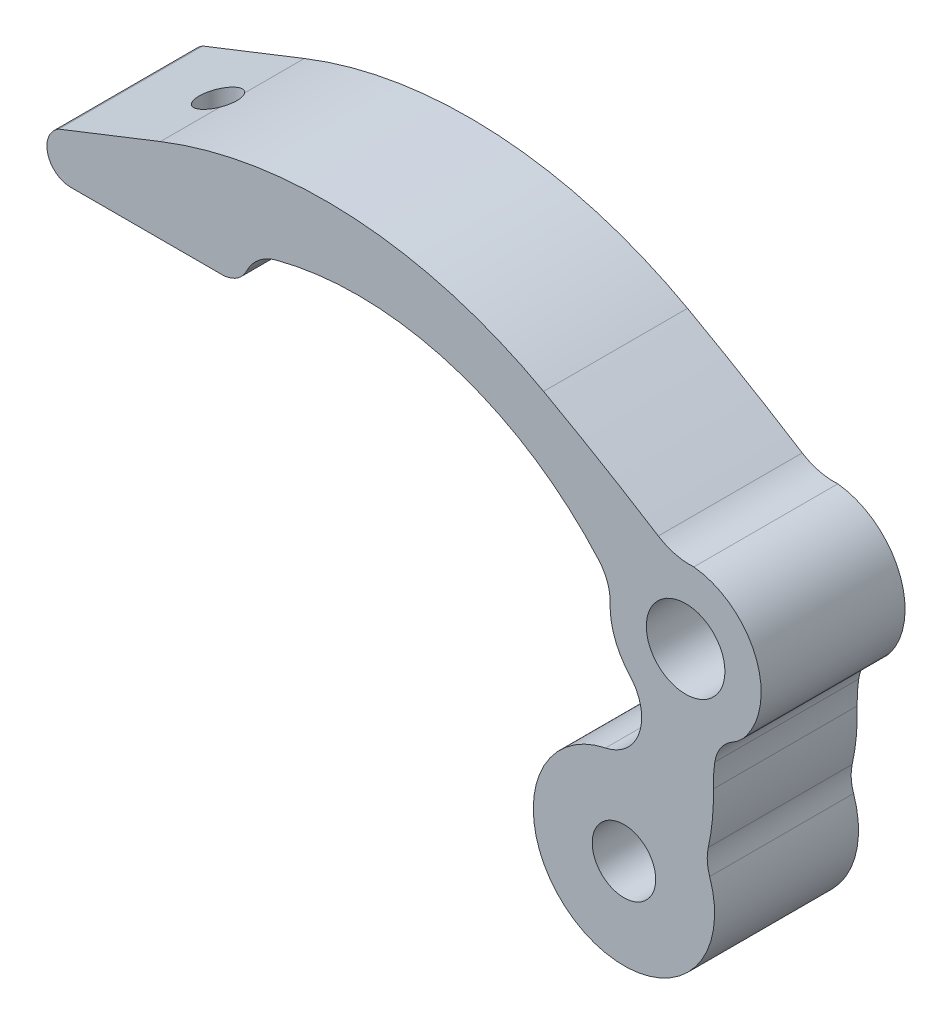
ISO-10303-21;
HEADER;
FILE_DESCRIPTION(('STEP AP214'),'2;1');
FILE_NAME('part.step','',(''),(''),'','','');
FILE_SCHEMA(('AUTOMOTIVE_DESIGN { 1 0 10303 214 1 1 1 1 }'));
ENDSEC;
DATA;
#1=APPLICATION_CONTEXT('core data for automotive mechanical design processes');
#2=APPLICATION_PROTOCOL_DEFINITION('international standard','automotive_design',2000,#1);
#3=PRODUCT_CONTEXT('',#1,'mechanical');
#4=PRODUCT('Part','Part','',(#3));
#5=PRODUCT_RELATED_PRODUCT_CATEGORY('part','',(#4));
#6=PRODUCT_DEFINITION_FORMATION('','',#4);
#7=PRODUCT_DEFINITION_CONTEXT('part definition',#1,'design');
#8=PRODUCT_DEFINITION('design','',#6,#7);
#9=PRODUCT_DEFINITION_SHAPE('','',#8);
#10=(LENGTH_UNIT() NAMED_UNIT(*) SI_UNIT(.MILLI.,.METRE.));
#11=(NAMED_UNIT(*) PLANE_ANGLE_UNIT() SI_UNIT($,.RADIAN.));
#12=(NAMED_UNIT(*) SI_UNIT($,.STERADIAN.) SOLID_ANGLE_UNIT());
#13=UNCERTAINTY_MEASURE_WITH_UNIT(LENGTH_MEASURE(1.E-05),#10,'distance_accuracy_value','');
#14=(GEOMETRIC_REPRESENTATION_CONTEXT(3) GLOBAL_UNCERTAINTY_ASSIGNED_CONTEXT((#13)) GLOBAL_UNIT_ASSIGNED_CONTEXT((#10,
#11,#12)) REPRESENTATION_CONTEXT('',''));
#15=CARTESIAN_POINT('',(0.,0.,0.));
#16=DIRECTION('',(0.,0.,1.));
#17=DIRECTION('',(1.,0.,0.));
#18=AXIS2_PLACEMENT_3D('',#15,#16,#17);
#19=CARTESIAN_POINT('',(34.1976725601195,34.6851142777333,9.6012));
#20=DIRECTION('',(0.,0.,-1.));
#21=DIRECTION('',(-1.,0.,0.));
#22=AXIS2_PLACEMENT_3D('',#19,#20,#21);
#23=CYLINDRICAL_SURFACE('',#22,2.99999999999999);
#24=CARTESIAN_POINT('',(34.1976725601195,34.6851142777333,0.0762));
#25=DIRECTION('',(0.,0.,1.));
#26=DIRECTION('',(1.,0.,0.));
#27=AXIS2_PLACEMENT_3D('',#24,#25,#26);
#28=CIRCLE('',#27,2.99999999999999);
#29=CARTESIAN_POINT('',(34.8071423863728,31.7476755071567,0.0762));
#30=VERTEX_POINT('',#29);
#31=CARTESIAN_POINT('',(36.4137606039046,36.7072304420998,0.0762));
#32=VERTEX_POINT('',#31);
#33=EDGE_CURVE('E210',#30,#32,#28,.T.);
#34=ORIENTED_EDGE('',*,*,#33,.F.);
#35=DIRECTION('',(0.,0.,-1.));
#36=VECTOR('',#35,1.);
#37=CARTESIAN_POINT('',(34.8071423863728,31.7476755071567,9.6012));
#38=LINE('',#37,#36);
#39=CARTESIAN_POINT('',(34.8071423863728,31.7476755071567,9.6012));
#40=VERTEX_POINT('',#39);
#41=EDGE_CURVE('E44',#40,#30,#38,.T.);
#42=ORIENTED_EDGE('',*,*,#41,.F.);
#43=CARTESIAN_POINT('',(34.1976725601195,34.6851142777333,9.6012));
#44=DIRECTION('',(0.,0.,1.));
#45=DIRECTION('',(1.,0.,0.));
#46=AXIS2_PLACEMENT_3D('',#43,#44,#45);
#47=CIRCLE('',#46,2.99999999999999);
#48=CARTESIAN_POINT('',(36.4137606039046,36.7072304420998,9.6012));
#49=VERTEX_POINT('',#48);
#50=EDGE_CURVE('E265',#40,#49,#47,.T.);
#51=ORIENTED_EDGE('',*,*,#50,.T.);
#52=DIRECTION('',(0.,0.,-1.));
#53=VECTOR('',#52,1.);
#54=CARTESIAN_POINT('',(36.4137606039046,36.7072304420998,9.6012));
#55=LINE('',#54,#53);
#56=EDGE_CURVE('E129',#49,#32,#55,.T.);
#57=ORIENTED_EDGE('',*,*,#56,.T.);
#58=EDGE_LOOP('',(#34,#42,#51,#57));
#59=FACE_BOUND('',#58,.T.);
#60=ADVANCED_FACE('F32',(#59),#23,.F.);
#61=CARTESIAN_POINT('',(36.0260820388794,25.8727979660034,9.6012));
#62=DIRECTION('',(0.,0.,-1.));
#63=DIRECTION('',(-1.,0.,0.));
#64=AXIS2_PLACEMENT_3D('',#61,#62,#63);
#65=CYLINDRICAL_SURFACE('',#64,6.00000000000001);
#66=CARTESIAN_POINT('',(36.0260820388794,25.8727979660034,0.0762));
#67=DIRECTION('',(0.,0.,-1.));
#68=DIRECTION('',(-1.,0.,0.));
#69=AXIS2_PLACEMENT_3D('',#66,#67,#68);
#70=CIRCLE('',#69,6.00000000000001);
#71=CARTESIAN_POINT('',(41.6999069433173,27.8241336505488,0.0762));
#72=VERTEX_POINT('',#71);
#73=EDGE_CURVE('E262',#72,#30,#70,.T.);
#74=ORIENTED_EDGE('',*,*,#73,.F.);
#75=DIRECTION('',(0.,0.,-1.));
#76=VECTOR('',#75,1.);
#77=CARTESIAN_POINT('',(41.6999069433173,27.8241336505488,9.6012));
#78=LINE('',#77,#76);
#79=CARTESIAN_POINT('',(41.6999069433173,27.8241336505488,9.6012));
#80=VERTEX_POINT('',#79);
#81=EDGE_CURVE('E191',#80,#72,#78,.T.);
#82=ORIENTED_EDGE('',*,*,#81,.F.);
#83=CARTESIAN_POINT('',(36.0260820388794,25.8727979660034,9.6012));
#84=DIRECTION('',(0.,0.,-1.));
#85=DIRECTION('',(-1.,0.,0.));
#86=AXIS2_PLACEMENT_3D('',#83,#84,#85);
#87=CIRCLE('',#86,6.00000000000001);
#88=EDGE_CURVE('E200',#80,#40,#87,.T.);
#89=ORIENTED_EDGE('',*,*,#88,.T.);
#90=ORIENTED_EDGE('',*,*,#41,.T.);
#91=EDGE_LOOP('',(#74,#82,#89,#90));
#92=FACE_BOUND('',#91,.T.);
#93=ADVANCED_FACE('F302',(#92),#65,.T.);
#94=CARTESIAN_POINT('',(44.5368193955363,28.7998014928215,9.6012));
#95=DIRECTION('',(0.,0.,-1.));
#96=DIRECTION('',(-1.,0.,0.));
#97=AXIS2_PLACEMENT_3D('',#94,#95,#96);
#98=CYLINDRICAL_SURFACE('',#97,3.00000000000002);
#99=CARTESIAN_POINT('',(44.5368193955363,28.7998014928215,0.0762));
#100=DIRECTION('',(0.,0.,1.));
#101=DIRECTION('',(1.,0.,0.));
#102=AXIS2_PLACEMENT_3D('',#99,#100,#101);
#103=CIRCLE('',#102,3.00000000000002);
#104=CARTESIAN_POINT('',(41.607603569719,29.447639933933,0.0762));
#105=VERTEX_POINT('',#104);
#106=EDGE_CURVE('E186',#105,#72,#103,.T.);
#107=ORIENTED_EDGE('',*,*,#106,.F.);
#108=DIRECTION('',(0.,0.,-1.));
#109=VECTOR('',#108,1.);
#110=CARTESIAN_POINT('',(41.607603569719,29.447639933933,9.6012));
#111=LINE('',#110,#109);
#112=CARTESIAN_POINT('',(41.607603569719,29.447639933933,9.6012));
#113=VERTEX_POINT('',#112);
#114=EDGE_CURVE('E180',#113,#105,#111,.T.);
#115=ORIENTED_EDGE('',*,*,#114,.F.);
#116=CARTESIAN_POINT('',(44.5368193955363,28.7998014928215,9.6012));
#117=DIRECTION('',(0.,0.,1.));
#118=DIRECTION('',(1.,0.,0.));
#119=AXIS2_PLACEMENT_3D('',#116,#117,#118);
#120=CIRCLE('',#119,3.00000000000002);
#121=EDGE_CURVE('E183',#113,#80,#120,.T.);
#122=ORIENTED_EDGE('',*,*,#121,.T.);
#123=ORIENTED_EDGE('',*,*,#81,.T.);
#124=EDGE_LOOP('',(#107,#115,#122,#123));
#125=FACE_BOUND('',#124,.T.);
#126=ADVANCED_FACE('F182',(#125),#98,.F.);
#127=CARTESIAN_POINT('',(27.6968955389819,32.5241941864271,9.6012));
#128=DIRECTION('',(0.,0.,-1.));
#129=DIRECTION('',(-1.,0.,0.));
#130=AXIS2_PLACEMENT_3D('',#127,#128,#129);
#131=CYLINDRICAL_SURFACE('',#130,14.246858740963);
#132=CARTESIAN_POINT('',(27.6968955389819,32.5241941864271,0.0762));
#133=DIRECTION('',(0.,0.,-1.));
#134=DIRECTION('',(-1.,0.,0.));
#135=AXIS2_PLACEMENT_3D('',#132,#133,#134);
#136=CIRCLE('',#135,14.246858740963);
#137=CARTESIAN_POINT('',(41.9371170292538,32.9590227652395,0.0762));
#138=VERTEX_POINT('',#137);
#139=EDGE_CURVE('E259',#138,#105,#136,.T.);
#140=ORIENTED_EDGE('',*,*,#139,.F.);
#141=DIRECTION('',(0.,0.,-1.));
#142=VECTOR('',#141,1.);
#143=CARTESIAN_POINT('',(41.9371170292538,32.9590227652395,9.6012));
#144=LINE('',#143,#142);
#145=CARTESIAN_POINT('',(41.9371170292538,32.9590227652395,9.6012));
#146=VERTEX_POINT('',#145);
#147=EDGE_CURVE('E192',#146,#138,#144,.T.);
#148=ORIENTED_EDGE('',*,*,#147,.F.);
#149=CARTESIAN_POINT('',(27.6968955389819,32.5241941864271,9.6012));
#150=DIRECTION('',(0.,0.,-1.));
#151=DIRECTION('',(-1.,0.,0.));
#152=AXIS2_PLACEMENT_3D('',#149,#150,#151);
#153=CIRCLE('',#152,14.246858740963);
#154=EDGE_CURVE('E198',#146,#113,#153,.T.);
#155=ORIENTED_EDGE('',*,*,#154,.T.);
#156=ORIENTED_EDGE('',*,*,#114,.T.);
#157=EDGE_LOOP('',(#140,#148,#155,#156));
#158=FACE_BOUND('',#157,.T.);
#159=ADVANCED_FACE('F202',(#158),#131,.T.);
#160=CARTESIAN_POINT('',(52.0850970582971,33.108050625971,9.6012));
#161=DIRECTION('',(0.,0.,-1.));
#162=DIRECTION('',(-1.,0.,0.));
#163=AXIS2_PLACEMENT_3D('',#160,#161,#162);
#164=CYLINDRICAL_SURFACE('',#163,10.1490742421728);
#165=CARTESIAN_POINT('',(52.0850970582971,33.108050625971,0.0762));
#166=DIRECTION('',(0.,0.,1.));
#167=DIRECTION('',(1.,0.,0.));
#168=AXIS2_PLACEMENT_3D('',#165,#166,#167);
#169=CIRCLE('',#168,10.1490742421728);
#170=CARTESIAN_POINT('',(42.0401867520476,34.5583902112192,0.0762));
#171=VERTEX_POINT('',#170);
#172=EDGE_CURVE('E256',#171,#138,#169,.T.);
#173=ORIENTED_EDGE('',*,*,#172,.F.);
#174=DIRECTION('',(0.,0.,-1.));
#175=VECTOR('',#174,1.);
#176=CARTESIAN_POINT('',(42.0401867520476,34.5583902112192,9.6012));
#177=LINE('',#176,#175);
#178=CARTESIAN_POINT('',(42.0401867520476,34.5583902112192,9.6012));
#179=VERTEX_POINT('',#178);
#180=EDGE_CURVE('E269',#179,#171,#177,.T.);
#181=ORIENTED_EDGE('',*,*,#180,.F.);
#182=CARTESIAN_POINT('',(52.0850970582971,33.108050625971,9.6012));
#183=DIRECTION('',(0.,0.,1.));
#184=DIRECTION('',(1.,0.,0.));
#185=AXIS2_PLACEMENT_3D('',#182,#183,#184);
#186=CIRCLE('',#185,10.1490742421728);
#187=EDGE_CURVE('E203',#179,#146,#186,.T.);
#188=ORIENTED_EDGE('',*,*,#187,.T.);
#189=ORIENTED_EDGE('',*,*,#147,.T.);
#190=EDGE_LOOP('',(#173,#181,#188,#189));
#191=FACE_BOUND('',#190,.T.);
#192=ADVANCED_FACE('F315',(#191),#164,.F.);
#193=CARTESIAN_POINT('',(44.4113302492937,34.2160314273662,9.6012));
#194=DIRECTION('',(0.,0.,-1.));
#195=DIRECTION('',(-1.,0.,0.));
#196=AXIS2_PLACEMENT_3D('',#193,#194,#195);
#197=CYLINDRICAL_SURFACE('',#196,2.39573183420304);
#198=CARTESIAN_POINT('',(44.4113302492937,34.2160314273662,0.0762));
#199=DIRECTION('',(0.,0.,1.));
#200=DIRECTION('',(1.,0.,0.));
#201=AXIS2_PLACEMENT_3D('',#198,#199,#200);
#202=CIRCLE('',#201,2.39573183420304);
#203=CARTESIAN_POINT('',(43.2152411622326,36.2918208957919,0.0762));
#204=VERTEX_POINT('',#203);
#205=EDGE_CURVE('E253',#204,#171,#202,.T.);
#206=ORIENTED_EDGE('',*,*,#205,.F.);
#207=DIRECTION('',(0.,0.,-1.));
#208=VECTOR('',#207,1.);
#209=CARTESIAN_POINT('',(43.2152411622326,36.2918208957919,9.6012));
#210=LINE('',#209,#208);
#211=CARTESIAN_POINT('',(43.2152411622326,36.2918208957919,9.6012));
#212=VERTEX_POINT('',#211);
#213=EDGE_CURVE('E271',#212,#204,#210,.T.);
#214=ORIENTED_EDGE('',*,*,#213,.F.);
#215=CARTESIAN_POINT('',(44.4113302492937,34.2160314273662,9.6012));
#216=DIRECTION('',(0.,0.,1.));
#217=DIRECTION('',(1.,0.,0.));
#218=AXIS2_PLACEMENT_3D('',#215,#216,#217);
#219=CIRCLE('',#218,2.39573183420304);
#220=EDGE_CURVE('E205',#212,#179,#219,.T.);
#221=ORIENTED_EDGE('',*,*,#220,.T.);
#222=ORIENTED_EDGE('',*,*,#180,.T.);
#223=EDGE_LOOP('',(#206,#214,#221,#222));
#224=FACE_BOUND('',#223,.T.);
#225=ADVANCED_FACE('F318',(#224),#197,.F.);
#226=CARTESIAN_POINT('',(41.7174661567186,38.8911804386135,9.6012));
#227=DIRECTION('',(0.,0.,-1.));
#228=DIRECTION('',(-1.,0.,0.));
#229=AXIS2_PLACEMENT_3D('',#226,#227,#228);
#230=CYLINDRICAL_SURFACE('',#229,3.);
#231=CARTESIAN_POINT('',(41.7174661567186,38.8911804386135,0.0762));
#232=DIRECTION('',(0.,0.,-1.));
#233=DIRECTION('',(-1.,0.,0.));
#234=AXIS2_PLACEMENT_3D('',#231,#232,#233);
#235=CIRCLE('',#234,3.);
#236=CARTESIAN_POINT('',(44.1328043764767,37.1118150224677,0.0762));
#237=VERTEX_POINT('',#236);
#238=EDGE_CURVE('E250',#237,#204,#235,.T.);
#239=ORIENTED_EDGE('',*,*,#238,.F.);
#240=DIRECTION('',(0.,0.,-1.));
#241=VECTOR('',#240,1.);
#242=CARTESIAN_POINT('',(44.1328043764767,37.1118150224677,9.6012));
#243=LINE('',#242,#241);
#244=CARTESIAN_POINT('',(44.1328043764767,37.1118150224677,9.6012));
#245=VERTEX_POINT('',#244);
#246=EDGE_CURVE('E273',#245,#237,#243,.T.);
#247=ORIENTED_EDGE('',*,*,#246,.F.);
#248=CARTESIAN_POINT('',(41.7174661567186,38.8911804386135,9.6012));
#249=DIRECTION('',(0.,0.,-1.));
#250=DIRECTION('',(-1.,0.,0.));
#251=AXIS2_PLACEMENT_3D('',#248,#249,#250);
#252=CIRCLE('',#251,3.);
#253=EDGE_CURVE('E448',#245,#212,#252,.T.);
#254=ORIENTED_EDGE('',*,*,#253,.T.);
#255=ORIENTED_EDGE('',*,*,#213,.T.);
#256=EDGE_LOOP('',(#239,#247,#254,#255));
#257=FACE_BOUND('',#256,.T.);
#258=ADVANCED_FACE('F322',(#257),#230,.T.);
#259=CARTESIAN_POINT('',(40.1072406768799,40.0774240493774,9.6012));
#260=DIRECTION('',(0.,0.,-1.));
#261=DIRECTION('',(-1.,0.,0.));
#262=AXIS2_PLACEMENT_3D('',#259,#260,#261);
#263=CYLINDRICAL_SURFACE('',#262,5.);
#264=CARTESIAN_POINT('',(40.1072406768799,40.0774240493774,0.0762));
#265=DIRECTION('',(0.,0.,-1.));
#266=DIRECTION('',(-1.,0.,0.));
#267=AXIS2_PLACEMENT_3D('',#264,#265,#266);
#268=CIRCLE('',#267,5.);
#269=CARTESIAN_POINT('',(40.6528115069562,45.0475701709086,0.0762));
#270=VERTEX_POINT('',#269);
#271=EDGE_CURVE('E247',#270,#237,#268,.T.);
#272=ORIENTED_EDGE('',*,*,#271,.F.);
#273=DIRECTION('',(0.,0.,-1.));
#274=VECTOR('',#273,1.);
#275=CARTESIAN_POINT('',(40.6528115069562,45.0475701709086,9.6012));
#276=LINE('',#275,#274);
#277=CARTESIAN_POINT('',(40.6528115069562,45.0475701709086,9.6012));
#278=VERTEX_POINT('',#277);
#279=EDGE_CURVE('E275',#278,#270,#276,.T.);
#280=ORIENTED_EDGE('',*,*,#279,.F.);
#281=CARTESIAN_POINT('',(40.1072406768799,40.0774240493774,9.6012));
#282=DIRECTION('',(0.,0.,-1.));
#283=DIRECTION('',(-1.,0.,0.));
#284=AXIS2_PLACEMENT_3D('',#281,#282,#283);
#285=CIRCLE('',#284,5.);
#286=EDGE_CURVE('E445',#278,#245,#285,.T.);
#287=ORIENTED_EDGE('',*,*,#286,.T.);
#288=ORIENTED_EDGE('',*,*,#246,.T.);
#289=EDGE_LOOP('',(#272,#280,#287,#288));
#290=FACE_BOUND('',#289,.T.);
#291=ADVANCED_FACE('F326',(#290),#263,.T.);
#292=CARTESIAN_POINT('',(40.3907888048875,48.9553963046518,9.6012));
#293=DIRECTION('',(0.,0.,-1.));
#294=DIRECTION('',(-1.,0.,0.));
#295=AXIS2_PLACEMENT_3D('',#292,#293,#294);
#296=CYLINDRICAL_SURFACE('',#295,3.91660069294357);
#297=CARTESIAN_POINT('',(40.3907888048875,48.9553963046518,0.0762));
#298=DIRECTION('',(0.,0.,1.));
#299=DIRECTION('',(1.,0.,0.));
#300=AXIS2_PLACEMENT_3D('',#297,#298,#299);
#301=CIRCLE('',#300,3.91660069294357);
#302=CARTESIAN_POINT('',(38.3003896869865,45.6432984021369,0.0762));
#303=VERTEX_POINT('',#302);
#304=EDGE_CURVE('E244',#303,#270,#301,.T.);
#305=ORIENTED_EDGE('',*,*,#304,.F.);
#306=DIRECTION('',(0.,0.,-1.));
#307=VECTOR('',#306,1.);
#308=CARTESIAN_POINT('',(38.3003896869865,45.6432984021369,9.6012));
#309=LINE('',#308,#307);
#310=CARTESIAN_POINT('',(38.3003896869865,45.6432984021369,9.6012));
#311=VERTEX_POINT('',#310);
#312=EDGE_CURVE('E277',#311,#303,#309,.T.);
#313=ORIENTED_EDGE('',*,*,#312,.F.);
#314=CARTESIAN_POINT('',(40.3907888048875,48.9553963046518,9.6012));
#315=DIRECTION('',(0.,0.,1.));
#316=DIRECTION('',(1.,0.,0.));
#317=AXIS2_PLACEMENT_3D('',#314,#315,#316);
#318=CIRCLE('',#317,3.91660069294357);
#319=EDGE_CURVE('E442',#311,#278,#318,.T.);
#320=ORIENTED_EDGE('',*,*,#319,.T.);
#321=ORIENTED_EDGE('',*,*,#279,.T.);
#322=EDGE_LOOP('',(#305,#313,#320,#321));
#323=FACE_BOUND('',#322,.T.);
#324=ADVANCED_FACE('F330',(#323),#296,.F.);
#325=CARTESIAN_POINT('',(-43.8886851648534,-84.5798059300966,9.6012));
#326=DIRECTION('',(0.,0.,-1.));
#327=DIRECTION('',(-1.,0.,0.));
#328=AXIS2_PLACEMENT_3D('',#325,#326,#327);
#329=CYLINDRICAL_SURFACE('',#328,153.990587137413);
#330=CARTESIAN_POINT('',(-43.8886851648534,-84.5798059300966,0.0762));
#331=DIRECTION('',(0.,0.,-1.));
#332=DIRECTION('',(-1.,0.,0.));
#333=AXIS2_PLACEMENT_3D('',#330,#331,#332);
#334=CIRCLE('',#333,153.990587137413);
#335=CARTESIAN_POINT('',(30.7093152869345,50.1355950288144,0.0762));
#336=VERTEX_POINT('',#335);
#337=EDGE_CURVE('E241',#336,#303,#334,.T.);
#338=ORIENTED_EDGE('',*,*,#337,.F.);
#339=DIRECTION('',(0.,0.,-1.));
#340=VECTOR('',#339,1.);
#341=CARTESIAN_POINT('',(30.7093152869345,50.1355950288144,9.6012));
#342=LINE('',#341,#340);
#343=CARTESIAN_POINT('',(30.7093152869345,50.1355950288144,9.6012));
#344=VERTEX_POINT('',#343);
#345=EDGE_CURVE('E279',#344,#336,#342,.T.);
#346=ORIENTED_EDGE('',*,*,#345,.F.);
#347=CARTESIAN_POINT('',(-43.8886851648534,-84.5798059300966,9.6012));
#348=DIRECTION('',(0.,0.,-1.));
#349=DIRECTION('',(-1.,0.,0.));
#350=AXIS2_PLACEMENT_3D('',#347,#348,#349);
#351=CIRCLE('',#350,153.990587137413);
#352=EDGE_CURVE('E439',#344,#311,#351,.T.);
#353=ORIENTED_EDGE('',*,*,#352,.T.);
#354=ORIENTED_EDGE('',*,*,#312,.T.);
#355=EDGE_LOOP('',(#338,#346,#353,#354));
#356=FACE_BOUND('',#355,.T.);
#357=ADVANCED_FACE('F334',(#356),#329,.T.);
#358=CARTESIAN_POINT('',(16.2866907932641,24.012696113313,9.6012));
#359=DIRECTION('',(0.,0.,-1.));
#360=DIRECTION('',(-1.,0.,0.));
#361=AXIS2_PLACEMENT_3D('',#358,#359,#360);
#362=CYLINDRICAL_SURFACE('',#361,29.8398717328833);
#363=CARTESIAN_POINT('',(5.35117979272073,51.7765673165858,5.65205399892177));
#364=CARTESIAN_POINT('',(5.37271989542802,51.7850514501931,5.62691635664572));
#365=CARTESIAN_POINT('',(5.39331887063302,51.7931359187546,5.6008549346207));
#366=CARTESIAN_POINT('',(5.43248499942247,51.8084620402505,5.54700545515649));
#367=CARTESIAN_POINT('',(5.45105169317695,51.8157035024674,5.5192170091765));
#368=CARTESIAN_POINT('',(5.50346119927931,51.8360911923921,5.43346634644107));
#369=CARTESIAN_POINT('',(5.53401805566715,51.8479025362392,5.37311343660468));
#370=CARTESIAN_POINT('',(5.58516447464055,51.8676066145244,5.24761391854735));
#371=CARTESIAN_POINT('',(5.60573581510238,51.875492185661,5.1824587945891));
#372=CARTESIAN_POINT('',(5.6360009669161,51.8870753395913,5.04935319245331));
#373=CARTESIAN_POINT('',(5.64570452149729,51.8907766736814,4.98140527484147));
#374=CARTESIAN_POINT('',(5.65373078276829,51.8938389134522,4.84678708657527));
#375=CARTESIAN_POINT('',(5.65238423262555,51.8933259574546,4.78013913669375));
#376=CARTESIAN_POINT('',(5.63914766691334,51.8882735831485,4.64802815384459));
#377=CARTESIAN_POINT('',(5.62725384907155,51.8837327127836,4.5825655568798));
#378=CARTESIAN_POINT('',(5.59354286041358,51.8708161492372,4.45528165978245));
#379=CARTESIAN_POINT('',(5.57181308958486,51.8624742270681,4.39343359410523));
#380=CARTESIAN_POINT('',(5.51926159662303,51.8421984407047,4.27439878880959));
#381=CARTESIAN_POINT('',(5.48844699470736,51.8302673893344,4.21720844334468));
#382=CARTESIAN_POINT('',(5.43808919222901,51.8106468780194,4.13881495554066));
#383=CARTESIAN_POINT('',(5.42171978868981,51.804253963307,4.11518049893423));
#384=CARTESIAN_POINT('',(5.38752329152176,51.7908607318587,4.06925423055405));
#385=CARTESIAN_POINT('',(5.36969938995589,51.7838617432598,4.0469596556739));
#386=CARTESIAN_POINT('',(5.35117979272077,51.7765673165858,4.0253460010782));
#387=B_SPLINE_CURVE_WITH_KNOTS('',3,(#363,#364,#365,#366,#367,#368,#369,#370,#371,#372,#373,
#374,#375,#376,#377,#378,#379,#380,#381,#382,#383,#384,#385,#386),.UNSPECIFIED.,.F.,.F.,(4,2,2,
2,2,2,2,2,2,2,2,4),(0.,0.102466264653516,0.204955665907866,0.409912804952171,0.6152425680612,
0.82038810041485,1.01941628797888,1.21851625405158,1.41588077666425,1.61309102459765,
1.70138680872826,1.78949377622891),.UNSPECIFIED.);
#388=CARTESIAN_POINT('',(5.35117979272071,51.7765673165858,5.65205399892179));
#389=VERTEX_POINT('',#388);
#390=CARTESIAN_POINT('',(5.35117979272073,51.7765673165858,4.02534600107823));
#391=VERTEX_POINT('',#390);
#392=EDGE_CURVE('E11',#389,#391,#387,.T.);
#393=ORIENTED_EDGE('',*,*,#392,.F.);
#394=DIRECTION('',(0.,0.,-1.));
#395=VECTOR('',#394,1.);
#396=CARTESIAN_POINT('',(5.35117979272071,51.7765673165858,9.6012));
#397=LINE('',#396,#395);
#398=CARTESIAN_POINT('',(5.35117979272071,51.7765673165858,9.6012));
#399=VERTEX_POINT('',#398);
#400=EDGE_CURVE('E281',#399,#389,#397,.T.);
#401=ORIENTED_EDGE('',*,*,#400,.F.);
#402=CARTESIAN_POINT('',(16.2866907932641,24.012696113313,9.6012));
#403=DIRECTION('',(0.,0.,-1.));
#404=DIRECTION('',(-1.,0.,0.));
#405=AXIS2_PLACEMENT_3D('',#402,#403,#404);
#406=CIRCLE('',#405,29.8398717328833);
#407=EDGE_CURVE('E436',#399,#344,#406,.T.);
#408=ORIENTED_EDGE('',*,*,#407,.T.);
#409=ORIENTED_EDGE('',*,*,#345,.T.);
#410=CARTESIAN_POINT('',(16.2866907932641,24.012696113313,0.0762));
#411=DIRECTION('',(0.,0.,-1.));
#412=DIRECTION('',(-1.,0.,0.));
#413=AXIS2_PLACEMENT_3D('',#410,#411,#412);
#414=CIRCLE('',#413,29.8398717328833);
#415=CARTESIAN_POINT('',(5.35117979272071,51.7765673165858,0.0762));
#416=VERTEX_POINT('',#415);
#417=EDGE_CURVE('E238',#416,#336,#414,.T.);
#418=ORIENTED_EDGE('',*,*,#417,.F.);
#419=EDGE_CURVE('E284',#391,#416,#397,.T.);
#420=ORIENTED_EDGE('',*,*,#419,.F.);
#421=EDGE_LOOP('',(#393,#401,#408,#409,#418,#420));
#422=FACE_BOUND('',#421,.T.);
#423=ADVANCED_FACE('F337',(#422),#362,.T.);
#424=CARTESIAN_POINT('',(-1.37579267656163,49.1269771027572,9.6012));
#425=DIRECTION('',(-0.366473123558792,0.930428637623038,0.));
#426=DIRECTION('',(-0.930428637623038,-0.366473123558792,0.));
#427=AXIS2_PLACEMENT_3D('',#424,#425,#426);
#428=PLANE('',#427);
#429=CARTESIAN_POINT('',(4.40199315541596,51.4027058749368,4.8387));
#430=DIRECTION('',(-0.366473123558792,0.930428637623038,0.));
#431=DIRECTION('',(-0.930428637623038,-0.366473123558792,0.));
#432=AXIS2_PLACEMENT_3D('',#429,#430,#431);
#433=ELLIPSE('',#432,1.34346681674949,1.24999999999999);
#434=EDGE_CURVE('E49',#391,#389,#433,.T.);
#435=ORIENTED_EDGE('',*,*,#434,.F.);
#436=ORIENTED_EDGE('',*,*,#419,.T.);
#437=DIRECTION('',(0.930428637623038,0.366473123558792,0.));
#438=VECTOR('',#437,1.);
#439=CARTESIAN_POINT('',(-1.37579267656163,49.1269771027572,0.0762));
#440=LINE('',#439,#438);
#441=CARTESIAN_POINT('',(-1.37579267656163,49.1269771027572,0.0762));
#442=VERTEX_POINT('',#441);
#443=EDGE_CURVE('E235',#442,#416,#440,.T.);
#444=ORIENTED_EDGE('',*,*,#443,.F.);
#445=DIRECTION('',(0.,0.,-1.));
#446=VECTOR('',#445,1.);
#447=CARTESIAN_POINT('',(-1.37579267656163,49.1269771027572,9.6012));
#448=LINE('',#447,#446);
#449=CARTESIAN_POINT('',(-1.37579267656163,49.1269771027572,9.6012));
#450=VERTEX_POINT('',#449);
#451=EDGE_CURVE('E285',#450,#442,#448,.T.);
#452=ORIENTED_EDGE('',*,*,#451,.F.);
#453=DIRECTION('',(0.930428637623038,0.366473123558792,0.));
#454=VECTOR('',#453,1.);
#455=CARTESIAN_POINT('',(-1.37579267656163,49.1269771027572,9.6012));
#456=LINE('',#455,#454);
#457=EDGE_CURVE('E433',#450,#399,#456,.T.);
#458=ORIENTED_EDGE('',*,*,#457,.T.);
#459=ORIENTED_EDGE('',*,*,#400,.T.);
#460=EDGE_LOOP('',(#435,#436,#444,#452,#458,#459));
#461=FACE_BOUND('',#460,.T.);
#462=ADVANCED_FACE('F342',(#461),#428,.T.);
#463=CARTESIAN_POINT('',(-0.5873827862046,47.7614079618236,9.6012));
#464=DIRECTION('',(0.,0.,-1.));
#465=DIRECTION('',(-1.,0.,0.));
#466=AXIS2_PLACEMENT_3D('',#463,#464,#465);
#467=CYLINDRICAL_SURFACE('',#466,1.5768225118519);
#468=CARTESIAN_POINT('',(-0.5873827862046,47.7614079618236,0.0762));
#469=DIRECTION('',(0.,0.,-1.));
#470=DIRECTION('',(-1.,0.,0.));
#471=AXIS2_PLACEMENT_3D('',#468,#469,#470);
#472=CIRCLE('',#471,1.5768225118519);
#473=CARTESIAN_POINT('',(-0.587382786205999,46.1845854499717,0.0762));
#474=VERTEX_POINT('',#473);
#475=EDGE_CURVE('E232',#474,#442,#472,.T.);
#476=ORIENTED_EDGE('',*,*,#475,.F.);
#477=DIRECTION('',(0.,0.,-1.));
#478=VECTOR('',#477,1.);
#479=CARTESIAN_POINT('',(-0.587382786205999,46.1845854499717,9.6012));
#480=LINE('',#479,#478);
#481=CARTESIAN_POINT('',(-0.587382786205999,46.1845854499717,9.6012));
#482=VERTEX_POINT('',#481);
#483=EDGE_CURVE('E287',#482,#474,#480,.T.);
#484=ORIENTED_EDGE('',*,*,#483,.F.);
#485=CARTESIAN_POINT('',(-0.5873827862046,47.7614079618236,9.6012));
#486=DIRECTION('',(0.,0.,-1.));
#487=DIRECTION('',(-1.,0.,0.));
#488=AXIS2_PLACEMENT_3D('',#485,#486,#487);
#489=CIRCLE('',#488,1.5768225118519);
#490=EDGE_CURVE('E430',#482,#450,#489,.T.);
#491=ORIENTED_EDGE('',*,*,#490,.T.);
#492=ORIENTED_EDGE('',*,*,#451,.T.);
#493=EDGE_LOOP('',(#476,#484,#491,#492));
#494=FACE_BOUND('',#493,.T.);
#495=ADVANCED_FACE('F346',(#494),#467,.T.);
#496=CARTESIAN_POINT('',(9.4126172137926,46.1845854499717,9.6012));
#497=DIRECTION('',(0.,-1.,0.));
#498=DIRECTION('',(1.,0.,0.));
#499=AXIS2_PLACEMENT_3D('',#496,#497,#498);
#500=PLANE('',#499);
#501=CARTESIAN_POINT('',(4.40199315541596,46.1845854499717,4.8387));
#502=DIRECTION('',(0.,-1.,0.));
#503=DIRECTION('',(0.,0.,-1.));
#504=AXIS2_PLACEMENT_3D('',#501,#502,#503);
#505=CIRCLE('',#504,1.24999999999999);
#506=CARTESIAN_POINT('',(4.40199315541596,46.1845854499717,3.58870000000001));
#507=VERTEX_POINT('',#506);
#508=EDGE_CURVE('E397',#507,#507,#505,.T.);
#509=ORIENTED_EDGE('',*,*,#508,.F.);
#510=EDGE_LOOP('',(#509));
#511=FACE_BOUND('',#510,.T.);
#512=DIRECTION('',(-1.,0.,0.));
#513=VECTOR('',#512,1.);
#514=CARTESIAN_POINT('',(9.4126172137926,46.1845854499717,0.0762));
#515=LINE('',#514,#513);
#516=CARTESIAN_POINT('',(9.4126172137926,46.1845854499717,0.0762));
#517=VERTEX_POINT('',#516);
#518=EDGE_CURVE('E229',#517,#474,#515,.T.);
#519=ORIENTED_EDGE('',*,*,#518,.F.);
#520=DIRECTION('',(0.,0.,-1.));
#521=VECTOR('',#520,1.);
#522=CARTESIAN_POINT('',(9.4126172137926,46.1845854499717,9.6012));
#523=LINE('',#522,#521);
#524=CARTESIAN_POINT('',(9.4126172137926,46.1845854499717,9.6012));
#525=VERTEX_POINT('',#524);
#526=EDGE_CURVE('E289',#525,#517,#523,.T.);
#527=ORIENTED_EDGE('',*,*,#526,.F.);
#528=DIRECTION('',(-1.,0.,0.));
#529=VECTOR('',#528,1.);
#530=CARTESIAN_POINT('',(9.4126172137926,46.1845854499717,9.6012));
#531=LINE('',#530,#529);
#532=EDGE_CURVE('E427',#525,#482,#531,.T.);
#533=ORIENTED_EDGE('',*,*,#532,.T.);
#534=ORIENTED_EDGE('',*,*,#483,.T.);
#535=EDGE_LOOP('',(#519,#527,#533,#534));
#536=FACE_BOUND('',#535,.T.);
#537=ADVANCED_FACE('F350',(#511,#536),#500,.T.);
#538=CARTESIAN_POINT('',(9.4126172137926,48.0153128520928,9.6012));
#539=DIRECTION('',(0.,0.,-1.));
#540=DIRECTION('',(-1.,0.,0.));
#541=AXIS2_PLACEMENT_3D('',#538,#539,#540);
#542=CYLINDRICAL_SURFACE('',#541,1.83072740212107);
#543=CARTESIAN_POINT('',(9.4126172137926,48.0153128520928,0.0762));
#544=DIRECTION('',(0.,0.,-1.));
#545=DIRECTION('',(-1.,0.,0.));
#546=AXIS2_PLACEMENT_3D('',#543,#544,#545);
#547=CIRCLE('',#546,1.83072740212107);
#548=CARTESIAN_POINT('',(11.0595581016238,47.2158451961701,0.0762));
#549=VERTEX_POINT('',#548);
#550=EDGE_CURVE('E226',#549,#517,#547,.T.);
#551=ORIENTED_EDGE('',*,*,#550,.F.);
#552=DIRECTION('',(0.,0.,-1.));
#553=VECTOR('',#552,1.);
#554=CARTESIAN_POINT('',(11.0595581016238,47.2158451961701,9.6012));
#555=LINE('',#554,#553);
#556=CARTESIAN_POINT('',(11.0595581016238,47.2158451961701,9.6012));
#557=VERTEX_POINT('',#556);
#558=EDGE_CURVE('E291',#557,#549,#555,.T.);
#559=ORIENTED_EDGE('',*,*,#558,.F.);
#560=CARTESIAN_POINT('',(9.4126172137926,48.0153128520928,9.6012));
#561=DIRECTION('',(0.,0.,-1.));
#562=DIRECTION('',(-1.,0.,0.));
#563=AXIS2_PLACEMENT_3D('',#560,#561,#562);
#564=CIRCLE('',#563,1.83072740212107);
#565=EDGE_CURVE('E424',#557,#525,#564,.T.);
#566=ORIENTED_EDGE('',*,*,#565,.T.);
#567=ORIENTED_EDGE('',*,*,#526,.T.);
#568=EDGE_LOOP('',(#551,#559,#566,#567));
#569=FACE_BOUND('',#568,.T.);
#570=ADVANCED_FACE('F354',(#569),#542,.T.);
#571=CARTESIAN_POINT('',(13.7583884451088,45.9057632227483,9.6012));
#572=DIRECTION('',(0.,0.,-1.));
#573=DIRECTION('',(-1.,0.,0.));
#574=AXIS2_PLACEMENT_3D('',#571,#572,#573);
#575=CYLINDRICAL_SURFACE('',#574,3.);
#576=CARTESIAN_POINT('',(13.7583884451088,45.9057632227483,0.0762));
#577=DIRECTION('',(0.,0.,1.));
#578=DIRECTION('',(1.,0.,0.));
#579=AXIS2_PLACEMENT_3D('',#576,#577,#578);
#580=CIRCLE('',#579,3.);
#581=CARTESIAN_POINT('',(12.9911918216827,48.8060062023973,0.0762));
#582=VERTEX_POINT('',#581);
#583=EDGE_CURVE('E223',#582,#549,#580,.T.);
#584=ORIENTED_EDGE('',*,*,#583,.F.);
#585=DIRECTION('',(0.,0.,-1.));
#586=VECTOR('',#585,1.);
#587=CARTESIAN_POINT('',(12.9911918216827,48.8060062023973,9.6012));
#588=LINE('',#587,#586);
#589=CARTESIAN_POINT('',(12.9911918216827,48.8060062023973,9.6012));
#590=VERTEX_POINT('',#589);
#591=EDGE_CURVE('E293',#590,#582,#588,.T.);
#592=ORIENTED_EDGE('',*,*,#591,.F.);
#593=CARTESIAN_POINT('',(13.7583884451088,45.9057632227483,9.6012));
#594=DIRECTION('',(0.,0.,1.));
#595=DIRECTION('',(1.,0.,0.));
#596=AXIS2_PLACEMENT_3D('',#593,#594,#595);
#597=CIRCLE('',#596,3.);
#598=EDGE_CURVE('E421',#590,#557,#597,.T.);
#599=ORIENTED_EDGE('',*,*,#598,.T.);
#600=ORIENTED_EDGE('',*,*,#558,.T.);
#601=EDGE_LOOP('',(#584,#592,#599,#600));
#602=FACE_BOUND('',#601,.T.);
#603=ADVANCED_FACE('F358',(#602),#575,.F.);
#604=CARTESIAN_POINT('',(18.4164760779677,28.2967363536542,9.6012));
#605=DIRECTION('',(0.,0.,-1.));
#606=DIRECTION('',(-1.,0.,0.));
#607=AXIS2_PLACEMENT_3D('',#604,#605,#606);
#608=CYLINDRICAL_SURFACE('',#607,21.2147085530313);
#609=CARTESIAN_POINT('',(18.4164760779677,28.2967363536542,0.0762));
#610=DIRECTION('',(0.,0.,1.));
#611=DIRECTION('',(1.,0.,0.));
#612=AXIS2_PLACEMENT_3D('',#609,#610,#611);
#613=CIRCLE('',#612,21.2147085530313);
#614=CARTESIAN_POINT('',(34.3659777731384,42.2852049855598,0.0762));
#615=VERTEX_POINT('',#614);
#616=EDGE_CURVE('E220',#615,#582,#613,.T.);
#617=ORIENTED_EDGE('',*,*,#616,.F.);
#618=DIRECTION('',(0.,0.,-1.));
#619=VECTOR('',#618,1.);
#620=CARTESIAN_POINT('',(34.3659777731384,42.2852049855598,9.6012));
#621=LINE('',#620,#619);
#622=CARTESIAN_POINT('',(34.3659777731384,42.2852049855598,9.6012));
#623=VERTEX_POINT('',#622);
#624=EDGE_CURVE('E295',#623,#615,#621,.T.);
#625=ORIENTED_EDGE('',*,*,#624,.F.);
#626=CARTESIAN_POINT('',(18.4164760779677,28.2967363536542,9.6012));
#627=DIRECTION('',(0.,0.,1.));
#628=DIRECTION('',(1.,0.,0.));
#629=AXIS2_PLACEMENT_3D('',#626,#627,#628);
#630=CIRCLE('',#629,21.2147085530313);
#631=EDGE_CURVE('E418',#623,#590,#630,.T.);
#632=ORIENTED_EDGE('',*,*,#631,.T.);
#633=ORIENTED_EDGE('',*,*,#591,.T.);
#634=EDGE_LOOP('',(#617,#625,#632,#633));
#635=FACE_BOUND('',#634,.T.);
#636=ADVANCED_FACE('F362',(#635),#608,.F.);
#637=CARTESIAN_POINT('',(32.1105376398976,40.3070771319146,9.6012));
#638=DIRECTION('',(0.,0.,-1.));
#639=DIRECTION('',(-1.,0.,0.));
#640=AXIS2_PLACEMENT_3D('',#637,#638,#639);
#641=CYLINDRICAL_SURFACE('',#640,3.00000000000001);
#642=CARTESIAN_POINT('',(32.1105376398976,40.3070771319146,0.0762));
#643=DIRECTION('',(0.,0.,1.));
#644=DIRECTION('',(1.,0.,0.));
#645=AXIS2_PLACEMENT_3D('',#642,#643,#644);
#646=CIRCLE('',#645,3.00000000000001);
#647=CARTESIAN_POINT('',(35.109301278766,40.2209572259631,0.0762));
#648=VERTEX_POINT('',#647);
#649=EDGE_CURVE('E217',#648,#615,#646,.T.);
#650=ORIENTED_EDGE('',*,*,#649,.F.);
#651=DIRECTION('',(0.,0.,-1.));
#652=VECTOR('',#651,1.);
#653=CARTESIAN_POINT('',(35.109301278766,40.2209572259631,9.6012));
#654=LINE('',#653,#652);
#655=CARTESIAN_POINT('',(35.109301278766,40.2209572259631,9.6012));
#656=VERTEX_POINT('',#655);
#657=EDGE_CURVE('E297',#656,#648,#654,.T.);
#658=ORIENTED_EDGE('',*,*,#657,.F.);
#659=CARTESIAN_POINT('',(32.1105376398976,40.3070771319146,9.6012));
#660=DIRECTION('',(0.,0.,1.));
#661=DIRECTION('',(1.,0.,0.));
#662=AXIS2_PLACEMENT_3D('',#659,#660,#661);
#663=CIRCLE('',#662,3.00000000000001);
#664=EDGE_CURVE('E415',#656,#623,#663,.T.);
#665=ORIENTED_EDGE('',*,*,#664,.T.);
#666=ORIENTED_EDGE('',*,*,#624,.T.);
#667=EDGE_LOOP('',(#650,#658,#665,#666));
#668=FACE_BOUND('',#667,.T.);
#669=ADVANCED_FACE('F366',(#668),#641,.F.);
#670=CARTESIAN_POINT('',(40.1072406768799,40.0774240493774,9.6012));
#671=DIRECTION('',(0.,0.,-1.));
#672=DIRECTION('',(-1.,0.,0.));
#673=AXIS2_PLACEMENT_3D('',#670,#671,#672);
#674=CYLINDRICAL_SURFACE('',#673,5.);
#675=CARTESIAN_POINT('',(40.1072406768799,40.0774240493774,0.0762));
#676=DIRECTION('',(0.,0.,-1.));
#677=DIRECTION('',(-1.,0.,0.));
#678=AXIS2_PLACEMENT_3D('',#675,#676,#677);
#679=CIRCLE('',#678,5.);
#680=EDGE_CURVE('E213',#32,#648,#679,.T.);
#681=ORIENTED_EDGE('',*,*,#680,.F.);
#682=ORIENTED_EDGE('',*,*,#56,.F.);
#683=CARTESIAN_POINT('',(40.1072406768799,40.0774240493774,9.6012));
#684=DIRECTION('',(0.,0.,-1.));
#685=DIRECTION('',(-1.,0.,0.));
#686=AXIS2_PLACEMENT_3D('',#683,#684,#685);
#687=CIRCLE('',#686,5.);
#688=EDGE_CURVE('E413',#49,#656,#687,.T.);
#689=ORIENTED_EDGE('',*,*,#688,.T.);
#690=ORIENTED_EDGE('',*,*,#657,.T.);
#691=EDGE_LOOP('',(#681,#682,#689,#690));
#692=FACE_BOUND('',#691,.T.);
#693=ADVANCED_FACE('F298',(#692),#674,.T.);
#694=CARTESIAN_POINT('',(34.1976725601195,34.6851142777333,9.6012));
#695=DIRECTION('',(0.,0.,1.));
#696=DIRECTION('',(1.,0.,0.));
#697=AXIS2_PLACEMENT_3D('',#694,#695,#696);
#698=PLANE('',#697);
#699=CARTESIAN_POINT('',(36.0260820388794,25.8727979660034,9.6012));
#700=DIRECTION('',(0.,0.,1.));
#701=DIRECTION('',(1.,0.,0.));
#702=AXIS2_PLACEMENT_3D('',#699,#700,#701);
#703=CIRCLE('',#702,2.09999999999998);
#704=CARTESIAN_POINT('',(38.1260820388794,25.8727979660034,9.6012));
#705=VERTEX_POINT('',#704);
#706=EDGE_CURVE('E399',#705,#705,#703,.T.);
#707=ORIENTED_EDGE('',*,*,#706,.F.);
#708=EDGE_LOOP('',(#707));
#709=FACE_BOUND('',#708,.T.);
#710=CARTESIAN_POINT('',(40.1072406768799,40.0774240493774,9.6012));
#711=DIRECTION('',(0.,0.,1.));
#712=DIRECTION('',(1.,0.,0.));
#713=AXIS2_PLACEMENT_3D('',#710,#711,#712);
#714=CIRCLE('',#713,2.59999999999998);
#715=CARTESIAN_POINT('',(42.7072406768799,40.0774240493774,9.6012));
#716=VERTEX_POINT('',#715);
#717=EDGE_CURVE('E407',#716,#716,#714,.T.);
#718=ORIENTED_EDGE('',*,*,#717,.F.);
#719=EDGE_LOOP('',(#718));
#720=FACE_BOUND('',#719,.T.);
#721=ORIENTED_EDGE('',*,*,#50,.F.);
#722=ORIENTED_EDGE('',*,*,#88,.F.);
#723=ORIENTED_EDGE('',*,*,#121,.F.);
#724=ORIENTED_EDGE('',*,*,#154,.F.);
#725=ORIENTED_EDGE('',*,*,#187,.F.);
#726=ORIENTED_EDGE('',*,*,#220,.F.);
#727=ORIENTED_EDGE('',*,*,#253,.F.);
#728=ORIENTED_EDGE('',*,*,#286,.F.);
#729=ORIENTED_EDGE('',*,*,#319,.F.);
#730=ORIENTED_EDGE('',*,*,#352,.F.);
#731=ORIENTED_EDGE('',*,*,#407,.F.);
#732=ORIENTED_EDGE('',*,*,#457,.F.);
#733=ORIENTED_EDGE('',*,*,#490,.F.);
#734=ORIENTED_EDGE('',*,*,#532,.F.);
#735=ORIENTED_EDGE('',*,*,#565,.F.);
#736=ORIENTED_EDGE('',*,*,#598,.F.);
#737=ORIENTED_EDGE('',*,*,#631,.F.);
#738=ORIENTED_EDGE('',*,*,#664,.F.);
#739=ORIENTED_EDGE('',*,*,#688,.F.);
#740=EDGE_LOOP('',(#721,#722,#723,#724,#725,#726,#727,#728,#729,#730,#731,#732,#733,#734,#735,
#736,#737,#738,#739));
#741=FACE_BOUND('',#740,.T.);
#742=ADVANCED_FACE('F196',(#709,#720,#741),#698,.T.);
#743=CARTESIAN_POINT('',(34.1976725601195,34.6851142777333,0.0762));
#744=DIRECTION('',(0.,0.,1.));
#745=DIRECTION('',(1.,0.,0.));
#746=AXIS2_PLACEMENT_3D('',#743,#744,#745);
#747=PLANE('',#746);
#748=CARTESIAN_POINT('',(36.0260820388794,25.8727979660034,0.0761999999999933));
#749=DIRECTION('',(0.,0.,1.));
#750=DIRECTION('',(1.,0.,0.));
#751=AXIS2_PLACEMENT_3D('',#748,#749,#750);
#752=CIRCLE('',#751,2.09999999999998);
#753=CARTESIAN_POINT('',(38.1260820388794,25.8727979660034,0.0761999999999933));
#754=VERTEX_POINT('',#753);
#755=EDGE_CURVE('E404',#754,#754,#752,.T.);
#756=ORIENTED_EDGE('',*,*,#755,.T.);
#757=EDGE_LOOP('',(#756));
#758=FACE_BOUND('',#757,.T.);
#759=CARTESIAN_POINT('',(40.1072406768799,40.0774240493774,0.0761999999999933));
#760=DIRECTION('',(0.,0.,1.));
#761=DIRECTION('',(1.,0.,0.));
#762=AXIS2_PLACEMENT_3D('',#759,#760,#761);
#763=CIRCLE('',#762,2.59999999999998);
#764=CARTESIAN_POINT('',(42.7072406768799,40.0774240493774,0.0761999999999933));
#765=VERTEX_POINT('',#764);
#766=EDGE_CURVE('E214',#765,#765,#763,.T.);
#767=ORIENTED_EDGE('',*,*,#766,.T.);
#768=EDGE_LOOP('',(#767));
#769=FACE_BOUND('',#768,.T.);
#770=ORIENTED_EDGE('',*,*,#33,.T.);
#771=ORIENTED_EDGE('',*,*,#680,.T.);
#772=ORIENTED_EDGE('',*,*,#649,.T.);
#773=ORIENTED_EDGE('',*,*,#616,.T.);
#774=ORIENTED_EDGE('',*,*,#583,.T.);
#775=ORIENTED_EDGE('',*,*,#550,.T.);
#776=ORIENTED_EDGE('',*,*,#518,.T.);
#777=ORIENTED_EDGE('',*,*,#475,.T.);
#778=ORIENTED_EDGE('',*,*,#443,.T.);
#779=ORIENTED_EDGE('',*,*,#417,.T.);
#780=ORIENTED_EDGE('',*,*,#337,.T.);
#781=ORIENTED_EDGE('',*,*,#304,.T.);
#782=ORIENTED_EDGE('',*,*,#271,.T.);
#783=ORIENTED_EDGE('',*,*,#238,.T.);
#784=ORIENTED_EDGE('',*,*,#205,.T.);
#785=ORIENTED_EDGE('',*,*,#172,.T.);
#786=ORIENTED_EDGE('',*,*,#139,.T.);
#787=ORIENTED_EDGE('',*,*,#106,.T.);
#788=ORIENTED_EDGE('',*,*,#73,.T.);
#789=EDGE_LOOP('',(#770,#771,#772,#773,#774,#775,#776,#777,#778,#779,#780,#781,#782,#783,#784,
#785,#786,#787,#788));
#790=FACE_BOUND('',#789,.T.);
#791=ADVANCED_FACE('F301',(#758,#769,#790),#747,.F.);
#792=CARTESIAN_POINT('',(40.1072406768799,40.0774240493774,9.6012));
#793=DIRECTION('',(0.,0.,1.));
#794=DIRECTION('',(1.,0.,0.));
#795=AXIS2_PLACEMENT_3D('',#792,#793,#794);
#796=CYLINDRICAL_SURFACE('',#795,2.59999999999998);
#797=ORIENTED_EDGE('',*,*,#766,.F.);
#798=EDGE_LOOP('',(#797));
#799=FACE_BOUND('',#798,.T.);
#800=ORIENTED_EDGE('',*,*,#717,.T.);
#801=EDGE_LOOP('',(#800));
#802=FACE_BOUND('',#801,.T.);
#803=ADVANCED_FACE('F378',(#799,#802),#796,.F.);
#804=CARTESIAN_POINT('',(36.0260820388794,25.8727979660034,9.6012));
#805=DIRECTION('',(0.,0.,1.));
#806=DIRECTION('',(1.,0.,0.));
#807=AXIS2_PLACEMENT_3D('',#804,#805,#806);
#808=CYLINDRICAL_SURFACE('',#807,2.09999999999998);
#809=ORIENTED_EDGE('',*,*,#755,.F.);
#810=EDGE_LOOP('',(#809));
#811=FACE_BOUND('',#810,.T.);
#812=ORIENTED_EDGE('',*,*,#706,.T.);
#813=EDGE_LOOP('',(#812));
#814=FACE_BOUND('',#813,.T.);
#815=ADVANCED_FACE('F385',(#811,#814),#808,.F.);
#816=CARTESIAN_POINT('',(4.40199315541596,46.1845854499717,4.8387));
#817=DIRECTION('',(0.,-1.,0.));
#818=DIRECTION('',(0.,0.,-1.));
#819=AXIS2_PLACEMENT_3D('',#816,#817,#818);
#820=CYLINDRICAL_SURFACE('',#819,1.24999999999999);
#821=ORIENTED_EDGE('',*,*,#434,.T.);
#822=ORIENTED_EDGE('',*,*,#392,.T.);
#823=EDGE_LOOP('',(#821,#822));
#824=FACE_BOUND('',#823,.T.);
#825=ORIENTED_EDGE('',*,*,#508,.T.);
#826=EDGE_LOOP('',(#825));
#827=FACE_BOUND('',#826,.T.);
#828=ADVANCED_FACE('F388',(#824,#827),#820,.F.);
#829=CLOSED_SHELL('',(#60,#93,#126,#159,#192,#225,#258,#291,#324,#357,#423,#462,#495,#537,#570,
#603,#636,#669,#693,#742,#791,#803,#815,#828));
#830=MANIFOLD_SOLID_BREP('B2',#829);
#831=ADVANCED_BREP_SHAPE_REPRESENTATION('',(#18,#830),#14);
#832=SHAPE_DEFINITION_REPRESENTATION(#9,#831);
ENDSEC;
END-ISO-10303-21;
